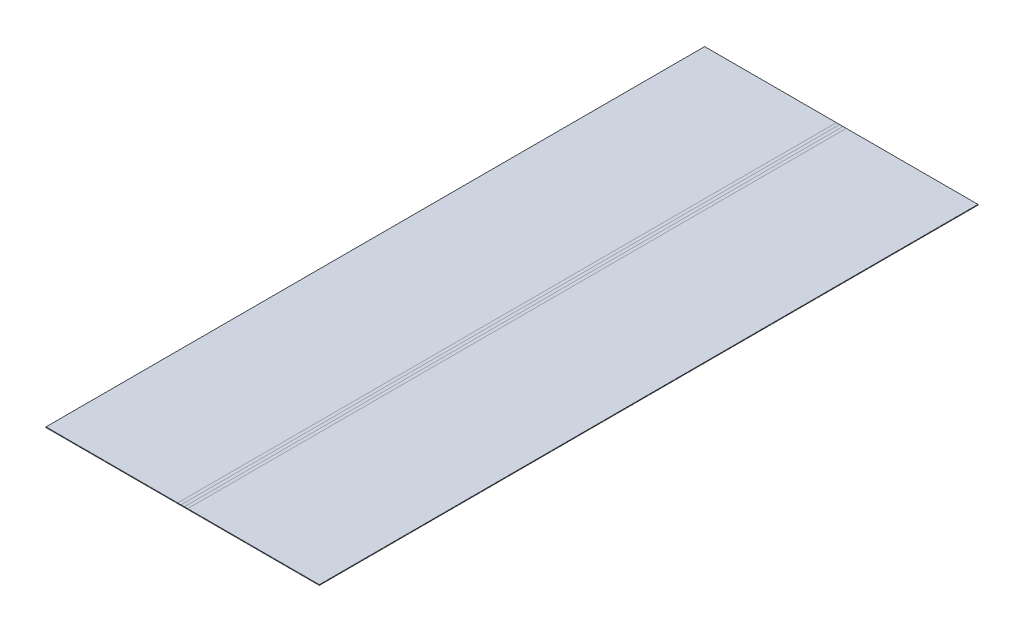
ISO-10303-21;
HEADER;
FILE_DESCRIPTION(('STEP AP214'),'2;1');
FILE_NAME('part.step','',(''),(''),'','','');
FILE_SCHEMA(('AUTOMOTIVE_DESIGN { 1 0 10303 214 1 1 1 1 }'));
ENDSEC;
DATA;
#1=APPLICATION_CONTEXT('core data for automotive mechanical design processes');
#2=APPLICATION_PROTOCOL_DEFINITION('international standard','automotive_design',2000,#1);
#3=PRODUCT_CONTEXT('',#1,'mechanical');
#4=PRODUCT('Part','Part','',(#3));
#5=PRODUCT_RELATED_PRODUCT_CATEGORY('part','',(#4));
#6=PRODUCT_DEFINITION_FORMATION('','',#4);
#7=PRODUCT_DEFINITION_CONTEXT('part definition',#1,'design');
#8=PRODUCT_DEFINITION('design','',#6,#7);
#9=PRODUCT_DEFINITION_SHAPE('','',#8);
#10=(LENGTH_UNIT() NAMED_UNIT(*) SI_UNIT(.MILLI.,.METRE.));
#11=(NAMED_UNIT(*) PLANE_ANGLE_UNIT() SI_UNIT($,.RADIAN.));
#12=(NAMED_UNIT(*) SI_UNIT($,.STERADIAN.) SOLID_ANGLE_UNIT());
#13=UNCERTAINTY_MEASURE_WITH_UNIT(LENGTH_MEASURE(1.E-05),#10,'distance_accuracy_value','');
#14=(GEOMETRIC_REPRESENTATION_CONTEXT(3) GLOBAL_UNCERTAINTY_ASSIGNED_CONTEXT((#13)) GLOBAL_UNIT_ASSIGNED_CONTEXT((#10,
#11,#12)) REPRESENTATION_CONTEXT('',''));
#15=CARTESIAN_POINT('',(0.,0.,0.));
#16=DIRECTION('',(0.,0.,1.));
#17=DIRECTION('',(1.,0.,0.));
#18=AXIS2_PLACEMENT_3D('',#15,#16,#17);
#19=CARTESIAN_POINT('',(2075.,10.,-1.84297022087776E-13));
#20=DIRECTION('',(1.,0.,0.));
#21=DIRECTION('',(0.,0.,-1.));
#22=AXIS2_PLACEMENT_3D('',#19,#20,#21);
#23=PLANE('',#22);
#24=DIRECTION('',(0.,0.,1.));
#25=VECTOR('',#24,1.);
#26=CARTESIAN_POINT('',(2075.,0.,-1.84297022087776E-13));
#27=LINE('',#26,#25);
#28=CARTESIAN_POINT('',(2075.,0.,-5000.));
#29=VERTEX_POINT('',#28);
#30=CARTESIAN_POINT('',(2075.,0.,5000.));
#31=VERTEX_POINT('',#30);
#32=EDGE_CURVE('E110',#29,#31,#27,.T.);
#33=ORIENTED_EDGE('',*,*,#32,.F.);
#34=DIRECTION('',(0.,-1.,0.));
#35=VECTOR('',#34,1.);
#36=CARTESIAN_POINT('',(2075.,10.,-5000.));
#37=LINE('',#36,#35);
#38=CARTESIAN_POINT('',(2075.,10.,-5000.));
#39=VERTEX_POINT('',#38);
#40=EDGE_CURVE('E12',#39,#29,#37,.T.);
#41=ORIENTED_EDGE('',*,*,#40,.F.);
#42=DIRECTION('',(0.,0.,1.));
#43=VECTOR('',#42,1.);
#44=CARTESIAN_POINT('',(2075.,10.,-1.84297022087776E-13));
#45=LINE('',#44,#43);
#46=CARTESIAN_POINT('',(2075.,10.,5000.));
#47=VERTEX_POINT('',#46);
#48=EDGE_CURVE('E104',#39,#47,#45,.T.);
#49=ORIENTED_EDGE('',*,*,#48,.T.);
#50=DIRECTION('',(0.,-1.,0.));
#51=VECTOR('',#50,1.);
#52=CARTESIAN_POINT('',(2075.,10.,5000.));
#53=LINE('',#52,#51);
#54=EDGE_CURVE('E85',#47,#31,#53,.T.);
#55=ORIENTED_EDGE('',*,*,#54,.T.);
#56=EDGE_LOOP('',(#33,#41,#49,#55));
#57=FACE_BOUND('',#56,.T.);
#58=ADVANCED_FACE('F47',(#57),#23,.T.);
#59=CARTESIAN_POINT('',(6.66133814775094E-12,10.,-5000.));
#60=DIRECTION('',(0.,0.,-1.));
#61=DIRECTION('',(-1.,0.,0.));
#62=AXIS2_PLACEMENT_3D('',#59,#60,#61);
#63=PLANE('',#62);
#64=DIRECTION('',(1.,0.,0.));
#65=VECTOR('',#64,1.);
#66=CARTESIAN_POINT('',(6.66133814775094E-12,0.,-5000.));
#67=LINE('',#66,#65);
#68=CARTESIAN_POINT('',(75.0000000000026,0.,-5000.));
#69=VERTEX_POINT('',#68);
#70=EDGE_CURVE('E98',#69,#29,#67,.T.);
#71=ORIENTED_EDGE('',*,*,#70,.F.);
#72=DIRECTION('',(0.,-1.,0.));
#73=VECTOR('',#72,1.);
#74=CARTESIAN_POINT('',(75.0000000000026,10.,-5000.));
#75=LINE('',#74,#73);
#76=CARTESIAN_POINT('',(75.0000000000026,10.,-5000.));
#77=VERTEX_POINT('',#76);
#78=EDGE_CURVE('E55',#77,#69,#75,.T.);
#79=ORIENTED_EDGE('',*,*,#78,.F.);
#80=DIRECTION('',(1.,0.,0.));
#81=VECTOR('',#80,1.);
#82=CARTESIAN_POINT('',(6.66133814775094E-12,10.,-5000.));
#83=LINE('',#82,#81);
#84=EDGE_CURVE('E96',#77,#39,#83,.T.);
#85=ORIENTED_EDGE('',*,*,#84,.T.);
#86=ORIENTED_EDGE('',*,*,#40,.T.);
#87=EDGE_LOOP('',(#71,#79,#85,#86));
#88=FACE_BOUND('',#87,.T.);
#89=ADVANCED_FACE('F94',(#88),#63,.T.);
#90=CARTESIAN_POINT('',(75.0000000000033,10.,0.));
#91=DIRECTION('',(1.,0.,0.));
#92=DIRECTION('',(0.,0.,-1.));
#93=AXIS2_PLACEMENT_3D('',#90,#91,#92);
#94=PLANE('',#93);
#95=DIRECTION('',(0.,0.,1.));
#96=VECTOR('',#95,1.);
#97=CARTESIAN_POINT('',(75.0000000000033,0.,0.));
#98=LINE('',#97,#96);
#99=CARTESIAN_POINT('',(75.0000000000039,0.,5000.));
#100=VERTEX_POINT('',#99);
#101=EDGE_CURVE('E78',#69,#100,#98,.T.);
#102=ORIENTED_EDGE('',*,*,#101,.T.);
#103=DIRECTION('',(0.,-1.,0.));
#104=VECTOR('',#103,1.);
#105=CARTESIAN_POINT('',(75.0000000000039,10.,5000.));
#106=LINE('',#105,#104);
#107=CARTESIAN_POINT('',(75.0000000000039,10.,5000.));
#108=VERTEX_POINT('',#107);
#109=EDGE_CURVE('E99',#108,#100,#106,.T.);
#110=ORIENTED_EDGE('',*,*,#109,.F.);
#111=DIRECTION('',(0.,0.,1.));
#112=VECTOR('',#111,1.);
#113=CARTESIAN_POINT('',(75.0000000000033,10.,0.));
#114=LINE('',#113,#112);
#115=EDGE_CURVE('E100',#77,#108,#114,.T.);
#116=ORIENTED_EDGE('',*,*,#115,.F.);
#117=ORIENTED_EDGE('',*,*,#78,.T.);
#118=EDGE_LOOP('',(#102,#110,#116,#117));
#119=FACE_BOUND('',#118,.T.);
#120=ADVANCED_FACE('F101',(#119),#94,.F.);
#121=CARTESIAN_POINT('',(-6.66133814775094E-12,10.,5000.));
#122=DIRECTION('',(0.,0.,-1.));
#123=DIRECTION('',(-1.,0.,0.));
#124=AXIS2_PLACEMENT_3D('',#121,#122,#123);
#125=PLANE('',#124);
#126=DIRECTION('',(1.,0.,0.));
#127=VECTOR('',#126,1.);
#128=CARTESIAN_POINT('',(-6.66133814775094E-12,0.,5000.));
#129=LINE('',#128,#127);
#130=EDGE_CURVE('E106',#100,#31,#129,.T.);
#131=ORIENTED_EDGE('',*,*,#130,.T.);
#132=ORIENTED_EDGE('',*,*,#54,.F.);
#133=DIRECTION('',(1.,0.,0.));
#134=VECTOR('',#133,1.);
#135=CARTESIAN_POINT('',(-6.66133814775094E-12,10.,5000.));
#136=LINE('',#135,#134);
#137=EDGE_CURVE('E63',#108,#47,#136,.T.);
#138=ORIENTED_EDGE('',*,*,#137,.F.);
#139=ORIENTED_EDGE('',*,*,#109,.T.);
#140=EDGE_LOOP('',(#131,#132,#138,#139));
#141=FACE_BOUND('',#140,.T.);
#142=ADVANCED_FACE('F119',(#141),#125,.F.);
#143=CARTESIAN_POINT('',(0.,10.,0.));
#144=DIRECTION('',(0.,1.,0.));
#145=DIRECTION('',(0.,0.,1.));
#146=AXIS2_PLACEMENT_3D('',#143,#144,#145);
#147=PLANE('',#146);
#148=ORIENTED_EDGE('',*,*,#48,.F.);
#149=ORIENTED_EDGE('',*,*,#84,.F.);
#150=ORIENTED_EDGE('',*,*,#115,.T.);
#151=ORIENTED_EDGE('',*,*,#137,.T.);
#152=EDGE_LOOP('',(#148,#149,#150,#151));
#153=FACE_BOUND('',#152,.T.);
#154=ADVANCED_FACE('F103',(#153),#147,.T.);
#155=CARTESIAN_POINT('',(0.,0.,0.));
#156=DIRECTION('',(0.,1.,0.));
#157=DIRECTION('',(0.,0.,1.));
#158=AXIS2_PLACEMENT_3D('',#155,#156,#157);
#159=PLANE('',#158);
#160=ORIENTED_EDGE('',*,*,#32,.T.);
#161=ORIENTED_EDGE('',*,*,#130,.F.);
#162=ORIENTED_EDGE('',*,*,#101,.F.);
#163=ORIENTED_EDGE('',*,*,#70,.T.);
#164=EDGE_LOOP('',(#160,#161,#162,#163));
#165=FACE_BOUND('',#164,.T.);
#166=ADVANCED_FACE('F121',(#165),#159,.F.);
#167=CLOSED_SHELL('',(#58,#89,#120,#142,#154,#166));
#168=MANIFOLD_SOLID_BREP('B2',#167);
#169=CARTESIAN_POINT('',(-75.0000000000033,10.,0.));
#170=DIRECTION('',(1.,0.,0.));
#171=DIRECTION('',(0.,0.,-1.));
#172=AXIS2_PLACEMENT_3D('',#169,#170,#171);
#173=PLANE('',#172);
#174=DIRECTION('',(0.,0.,1.));
#175=VECTOR('',#174,1.);
#176=CARTESIAN_POINT('',(-75.0000000000033,0.,0.));
#177=LINE('',#176,#175);
#178=CARTESIAN_POINT('',(-75.0000000000026,0.,-5000.));
#179=VERTEX_POINT('',#178);
#180=CARTESIAN_POINT('',(-75.0000000000039,0.,5000.));
#181=VERTEX_POINT('',#180);
#182=EDGE_CURVE('E248',#179,#181,#177,.T.);
#183=ORIENTED_EDGE('',*,*,#182,.F.);
#184=DIRECTION('',(0.,-1.,0.));
#185=VECTOR('',#184,1.);
#186=CARTESIAN_POINT('',(-75.0000000000026,10.,-5000.));
#187=LINE('',#186,#185);
#188=CARTESIAN_POINT('',(-75.0000000000026,10.,-5000.));
#189=VERTEX_POINT('',#188);
#190=EDGE_CURVE('E45',#189,#179,#187,.T.);
#191=ORIENTED_EDGE('',*,*,#190,.F.);
#192=DIRECTION('',(0.,0.,1.));
#193=VECTOR('',#192,1.);
#194=CARTESIAN_POINT('',(-75.0000000000033,10.,0.));
#195=LINE('',#194,#193);
#196=CARTESIAN_POINT('',(-75.0000000000039,10.,5000.));
#197=VERTEX_POINT('',#196);
#198=EDGE_CURVE('E233',#189,#197,#195,.T.);
#199=ORIENTED_EDGE('',*,*,#198,.T.);
#200=DIRECTION('',(0.,-1.,0.));
#201=VECTOR('',#200,1.);
#202=CARTESIAN_POINT('',(-75.0000000000039,10.,5000.));
#203=LINE('',#202,#201);
#204=EDGE_CURVE('E201',#197,#181,#203,.T.);
#205=ORIENTED_EDGE('',*,*,#204,.T.);
#206=EDGE_LOOP('',(#183,#191,#199,#205));
#207=FACE_BOUND('',#206,.T.);
#208=ADVANCED_FACE('F185',(#207),#173,.T.);
#209=CARTESIAN_POINT('',(-6.66133814775094E-12,10.,-5000.));
#210=DIRECTION('',(0.,0.,1.));
#211=DIRECTION('',(1.,0.,0.));
#212=AXIS2_PLACEMENT_3D('',#209,#210,#211);
#213=PLANE('',#212);
#214=DIRECTION('',(-1.,0.,0.));
#215=VECTOR('',#214,1.);
#216=CARTESIAN_POINT('',(-6.66133814775094E-12,0.,-5000.));
#217=LINE('',#216,#215);
#218=CARTESIAN_POINT('',(-2075.,0.,-5000.));
#219=VERTEX_POINT('',#218);
#220=EDGE_CURVE('E239',#179,#219,#217,.T.);
#221=ORIENTED_EDGE('',*,*,#220,.T.);
#222=DIRECTION('',(0.,-1.,0.));
#223=VECTOR('',#222,1.);
#224=CARTESIAN_POINT('',(-2075.,10.,-5000.));
#225=LINE('',#224,#223);
#226=CARTESIAN_POINT('',(-2075.,10.,-5000.));
#227=VERTEX_POINT('',#226);
#228=EDGE_CURVE('E193',#227,#219,#225,.T.);
#229=ORIENTED_EDGE('',*,*,#228,.F.);
#230=DIRECTION('',(-1.,0.,0.));
#231=VECTOR('',#230,1.);
#232=CARTESIAN_POINT('',(-6.66133814775094E-12,10.,-5000.));
#233=LINE('',#232,#231);
#234=EDGE_CURVE('E227',#189,#227,#233,.T.);
#235=ORIENTED_EDGE('',*,*,#234,.F.);
#236=ORIENTED_EDGE('',*,*,#190,.T.);
#237=EDGE_LOOP('',(#221,#229,#235,#236));
#238=FACE_BOUND('',#237,.T.);
#239=ADVANCED_FACE('F237',(#238),#213,.F.);
#240=CARTESIAN_POINT('',(-2075.,10.,-1.84297022087776E-13));
#241=DIRECTION('',(1.,0.,0.));
#242=DIRECTION('',(0.,0.,-1.));
#243=AXIS2_PLACEMENT_3D('',#240,#241,#242);
#244=PLANE('',#243);
#245=DIRECTION('',(0.,0.,1.));
#246=VECTOR('',#245,1.);
#247=CARTESIAN_POINT('',(-2075.,0.,-1.84297022087776E-13));
#248=LINE('',#247,#246);
#249=CARTESIAN_POINT('',(-2075.,0.,5000.));
#250=VERTEX_POINT('',#249);
#251=EDGE_CURVE('E251',#219,#250,#248,.T.);
#252=ORIENTED_EDGE('',*,*,#251,.T.);
#253=DIRECTION('',(0.,-1.,0.));
#254=VECTOR('',#253,1.);
#255=CARTESIAN_POINT('',(-2075.,10.,5000.));
#256=LINE('',#255,#254);
#257=CARTESIAN_POINT('',(-2075.,10.,5000.));
#258=VERTEX_POINT('',#257);
#259=EDGE_CURVE('E215',#258,#250,#256,.T.);
#260=ORIENTED_EDGE('',*,*,#259,.F.);
#261=DIRECTION('',(0.,0.,1.));
#262=VECTOR('',#261,1.);
#263=CARTESIAN_POINT('',(-2075.,10.,-1.84297022087776E-13));
#264=LINE('',#263,#262);
#265=EDGE_CURVE('E232',#227,#258,#264,.T.);
#266=ORIENTED_EDGE('',*,*,#265,.F.);
#267=ORIENTED_EDGE('',*,*,#228,.T.);
#268=EDGE_LOOP('',(#252,#260,#266,#267));
#269=FACE_BOUND('',#268,.T.);
#270=ADVANCED_FACE('F242',(#269),#244,.F.);
#271=CARTESIAN_POINT('',(6.66133814775094E-12,10.,5000.));
#272=DIRECTION('',(0.,0.,1.));
#273=DIRECTION('',(1.,0.,0.));
#274=AXIS2_PLACEMENT_3D('',#271,#272,#273);
#275=PLANE('',#274);
#276=DIRECTION('',(-1.,0.,0.));
#277=VECTOR('',#276,1.);
#278=CARTESIAN_POINT('',(6.66133814775094E-12,0.,5000.));
#279=LINE('',#278,#277);
#280=EDGE_CURVE('E253',#181,#250,#279,.T.);
#281=ORIENTED_EDGE('',*,*,#280,.F.);
#282=ORIENTED_EDGE('',*,*,#204,.F.);
#283=DIRECTION('',(-1.,0.,0.));
#284=VECTOR('',#283,1.);
#285=CARTESIAN_POINT('',(6.66133814775094E-12,10.,5000.));
#286=LINE('',#285,#284);
#287=EDGE_CURVE('E243',#197,#258,#286,.T.);
#288=ORIENTED_EDGE('',*,*,#287,.T.);
#289=ORIENTED_EDGE('',*,*,#259,.T.);
#290=EDGE_LOOP('',(#281,#282,#288,#289));
#291=FACE_BOUND('',#290,.T.);
#292=ADVANCED_FACE('F258',(#291),#275,.T.);
#293=CARTESIAN_POINT('',(0.,10.,0.));
#294=DIRECTION('',(0.,1.,0.));
#295=DIRECTION('',(0.,0.,1.));
#296=AXIS2_PLACEMENT_3D('',#293,#294,#295);
#297=PLANE('',#296);
#298=ORIENTED_EDGE('',*,*,#198,.F.);
#299=ORIENTED_EDGE('',*,*,#234,.T.);
#300=ORIENTED_EDGE('',*,*,#265,.T.);
#301=ORIENTED_EDGE('',*,*,#287,.F.);
#302=EDGE_LOOP('',(#298,#299,#300,#301));
#303=FACE_BOUND('',#302,.T.);
#304=ADVANCED_FACE('F229',(#303),#297,.T.);
#305=CARTESIAN_POINT('',(0.,0.,0.));
#306=DIRECTION('',(0.,1.,0.));
#307=DIRECTION('',(0.,0.,1.));
#308=AXIS2_PLACEMENT_3D('',#305,#306,#307);
#309=PLANE('',#308);
#310=ORIENTED_EDGE('',*,*,#182,.T.);
#311=ORIENTED_EDGE('',*,*,#280,.T.);
#312=ORIENTED_EDGE('',*,*,#251,.F.);
#313=ORIENTED_EDGE('',*,*,#220,.F.);
#314=EDGE_LOOP('',(#310,#311,#312,#313));
#315=FACE_BOUND('',#314,.T.);
#316=ADVANCED_FACE('F265',(#315),#309,.F.);
#317=CLOSED_SHELL('',(#208,#239,#270,#292,#304,#316));
#318=MANIFOLD_SOLID_BREP('B6',#317);
#319=CARTESIAN_POINT('',(75.0000000000033,10.,0.));
#320=DIRECTION('',(1.,0.,0.));
#321=DIRECTION('',(0.,0.,-1.));
#322=AXIS2_PLACEMENT_3D('',#319,#320,#321);
#323=PLANE('',#322);
#324=DIRECTION('',(0.,0.,1.));
#325=VECTOR('',#324,1.);
#326=CARTESIAN_POINT('',(75.0000000000033,0.,0.));
#327=LINE('',#326,#325);
#328=CARTESIAN_POINT('',(75.0000000000026,0.,-5000.));
#329=VERTEX_POINT('',#328);
#330=CARTESIAN_POINT('',(75.0000000000039,0.,5000.));
#331=VERTEX_POINT('',#330);
#332=EDGE_CURVE('E386',#329,#331,#327,.T.);
#333=ORIENTED_EDGE('',*,*,#332,.F.);
#334=DIRECTION('',(0.,-1.,0.));
#335=VECTOR('',#334,1.);
#336=CARTESIAN_POINT('',(75.0000000000026,10.,-5000.));
#337=LINE('',#336,#335);
#338=CARTESIAN_POINT('',(75.0000000000026,10.,-5000.));
#339=VERTEX_POINT('',#338);
#340=EDGE_CURVE('E183',#339,#329,#337,.T.);
#341=ORIENTED_EDGE('',*,*,#340,.F.);
#342=DIRECTION('',(0.,0.,1.));
#343=VECTOR('',#342,1.);
#344=CARTESIAN_POINT('',(75.0000000000033,10.,0.));
#345=LINE('',#344,#343);
#346=CARTESIAN_POINT('',(75.0000000000039,10.,5000.));
#347=VERTEX_POINT('',#346);
#348=EDGE_CURVE('E379',#339,#347,#345,.T.);
#349=ORIENTED_EDGE('',*,*,#348,.T.);
#350=DIRECTION('',(0.,-1.,0.));
#351=VECTOR('',#350,1.);
#352=CARTESIAN_POINT('',(75.0000000000039,10.,5000.));
#353=LINE('',#352,#351);
#354=EDGE_CURVE('E361',#347,#331,#353,.T.);
#355=ORIENTED_EDGE('',*,*,#354,.T.);
#356=EDGE_LOOP('',(#333,#341,#349,#355));
#357=FACE_BOUND('',#356,.T.);
#358=ADVANCED_FACE('F323',(#357),#323,.T.);
#359=CARTESIAN_POINT('',(0.,10.,-5000.));
#360=DIRECTION('',(0.,0.,-1.));
#361=DIRECTION('',(-1.,0.,0.));
#362=AXIS2_PLACEMENT_3D('',#359,#360,#361);
#363=PLANE('',#362);
#364=DIRECTION('',(1.,0.,0.));
#365=VECTOR('',#364,1.);
#366=CARTESIAN_POINT('',(0.,0.,-5000.));
#367=LINE('',#366,#365);
#368=CARTESIAN_POINT('',(25.0000000000027,0.,-5000.));
#369=VERTEX_POINT('',#368);
#370=EDGE_CURVE('E372',#369,#329,#367,.T.);
#371=ORIENTED_EDGE('',*,*,#370,.F.);
#372=DIRECTION('',(0.,-1.,0.));
#373=VECTOR('',#372,1.);
#374=CARTESIAN_POINT('',(25.0000000000027,10.,-5000.));
#375=LINE('',#374,#373);
#376=CARTESIAN_POINT('',(25.0000000000027,10.,-5000.));
#377=VERTEX_POINT('',#376);
#378=EDGE_CURVE('E331',#377,#369,#375,.T.);
#379=ORIENTED_EDGE('',*,*,#378,.F.);
#380=DIRECTION('',(1.,0.,0.));
#381=VECTOR('',#380,1.);
#382=CARTESIAN_POINT('',(0.,10.,-5000.));
#383=LINE('',#382,#381);
#384=EDGE_CURVE('E370',#377,#339,#383,.T.);
#385=ORIENTED_EDGE('',*,*,#384,.T.);
#386=ORIENTED_EDGE('',*,*,#340,.T.);
#387=EDGE_LOOP('',(#371,#379,#385,#386));
#388=FACE_BOUND('',#387,.T.);
#389=ADVANCED_FACE('F369',(#388),#363,.T.);
#390=CARTESIAN_POINT('',(25.0000000000027,10.,0.));
#391=DIRECTION('',(-1.,0.,0.));
#392=DIRECTION('',(0.,0.,1.));
#393=AXIS2_PLACEMENT_3D('',#390,#391,#392);
#394=PLANE('',#393);
#395=DIRECTION('',(0.,0.,-1.));
#396=VECTOR('',#395,1.);
#397=CARTESIAN_POINT('',(25.0000000000027,0.,0.));
#398=LINE('',#397,#396);
#399=CARTESIAN_POINT('',(25.0000000000027,0.,5000.));
#400=VERTEX_POINT('',#399);
#401=EDGE_CURVE('E390',#400,#369,#398,.T.);
#402=ORIENTED_EDGE('',*,*,#401,.F.);
#403=DIRECTION('',(0.,-1.,0.));
#404=VECTOR('',#403,1.);
#405=CARTESIAN_POINT('',(25.0000000000027,10.,5000.));
#406=LINE('',#405,#404);
#407=CARTESIAN_POINT('',(25.0000000000027,10.,5000.));
#408=VERTEX_POINT('',#407);
#409=EDGE_CURVE('E354',#408,#400,#406,.T.);
#410=ORIENTED_EDGE('',*,*,#409,.F.);
#411=DIRECTION('',(0.,0.,-1.));
#412=VECTOR('',#411,1.);
#413=CARTESIAN_POINT('',(25.0000000000027,10.,0.));
#414=LINE('',#413,#412);
#415=EDGE_CURVE('E378',#408,#377,#414,.T.);
#416=ORIENTED_EDGE('',*,*,#415,.T.);
#417=ORIENTED_EDGE('',*,*,#378,.T.);
#418=EDGE_LOOP('',(#402,#410,#416,#417));
#419=FACE_BOUND('',#418,.T.);
#420=ADVANCED_FACE('F381',(#419),#394,.T.);
#421=CARTESIAN_POINT('',(0.,10.,5000.));
#422=DIRECTION('',(0.,0.,-1.));
#423=DIRECTION('',(-1.,0.,0.));
#424=AXIS2_PLACEMENT_3D('',#421,#422,#423);
#425=PLANE('',#424);
#426=DIRECTION('',(1.,0.,0.));
#427=VECTOR('',#426,1.);
#428=CARTESIAN_POINT('',(0.,0.,5000.));
#429=LINE('',#428,#427);
#430=EDGE_CURVE('E392',#400,#331,#429,.T.);
#431=ORIENTED_EDGE('',*,*,#430,.T.);
#432=ORIENTED_EDGE('',*,*,#354,.F.);
#433=DIRECTION('',(1.,0.,0.));
#434=VECTOR('',#433,1.);
#435=CARTESIAN_POINT('',(0.,10.,5000.));
#436=LINE('',#435,#434);
#437=EDGE_CURVE('E339',#408,#347,#436,.T.);
#438=ORIENTED_EDGE('',*,*,#437,.F.);
#439=ORIENTED_EDGE('',*,*,#409,.T.);
#440=EDGE_LOOP('',(#431,#432,#438,#439));
#441=FACE_BOUND('',#440,.T.);
#442=ADVANCED_FACE('F402',(#441),#425,.F.);
#443=CARTESIAN_POINT('',(0.,10.,0.));
#444=DIRECTION('',(0.,1.,0.));
#445=DIRECTION('',(0.,0.,1.));
#446=AXIS2_PLACEMENT_3D('',#443,#444,#445);
#447=PLANE('',#446);
#448=ORIENTED_EDGE('',*,*,#348,.F.);
#449=ORIENTED_EDGE('',*,*,#384,.F.);
#450=ORIENTED_EDGE('',*,*,#415,.F.);
#451=ORIENTED_EDGE('',*,*,#437,.T.);
#452=EDGE_LOOP('',(#448,#449,#450,#451));
#453=FACE_BOUND('',#452,.T.);
#454=ADVANCED_FACE('F377',(#453),#447,.T.);
#455=CARTESIAN_POINT('',(0.,0.,0.));
#456=DIRECTION('',(0.,1.,0.));
#457=DIRECTION('',(0.,0.,1.));
#458=AXIS2_PLACEMENT_3D('',#455,#456,#457);
#459=PLANE('',#458);
#460=ORIENTED_EDGE('',*,*,#332,.T.);
#461=ORIENTED_EDGE('',*,*,#430,.F.);
#462=ORIENTED_EDGE('',*,*,#401,.T.);
#463=ORIENTED_EDGE('',*,*,#370,.T.);
#464=EDGE_LOOP('',(#460,#461,#462,#463));
#465=FACE_BOUND('',#464,.T.);
#466=ADVANCED_FACE('F407',(#465),#459,.F.);
#467=CLOSED_SHELL('',(#358,#389,#420,#442,#454,#466));
#468=MANIFOLD_SOLID_BREP('B39',#467);
#469=CARTESIAN_POINT('',(-25.,10.,0.));
#470=DIRECTION('',(-1.,0.,0.));
#471=DIRECTION('',(0.,0.,1.));
#472=AXIS2_PLACEMENT_3D('',#469,#470,#471);
#473=PLANE('',#472);
#474=DIRECTION('',(0.,0.,-1.));
#475=VECTOR('',#474,1.);
#476=CARTESIAN_POINT('',(-25.,0.,0.));
#477=LINE('',#476,#475);
#478=CARTESIAN_POINT('',(-25.0000000000027,0.,5000.));
#479=VERTEX_POINT('',#478);
#480=CARTESIAN_POINT('',(-24.9999999999974,0.,-5000.));
#481=VERTEX_POINT('',#480);
#482=EDGE_CURVE('E526',#479,#481,#477,.T.);
#483=ORIENTED_EDGE('',*,*,#482,.T.);
#484=DIRECTION('',(0.,-1.,0.));
#485=VECTOR('',#484,1.);
#486=CARTESIAN_POINT('',(-24.9999999999974,10.,-5000.));
#487=LINE('',#486,#485);
#488=CARTESIAN_POINT('',(-24.9999999999974,10.,-5000.));
#489=VERTEX_POINT('',#488);
#490=EDGE_CURVE('E321',#489,#481,#487,.T.);
#491=ORIENTED_EDGE('',*,*,#490,.F.);
#492=DIRECTION('',(0.,0.,-1.));
#493=VECTOR('',#492,1.);
#494=CARTESIAN_POINT('',(-25.,10.,0.));
#495=LINE('',#494,#493);
#496=CARTESIAN_POINT('',(-25.0000000000027,10.,5000.));
#497=VERTEX_POINT('',#496);
#498=EDGE_CURVE('E512',#497,#489,#495,.T.);
#499=ORIENTED_EDGE('',*,*,#498,.F.);
#500=DIRECTION('',(0.,-1.,0.));
#501=VECTOR('',#500,1.);
#502=CARTESIAN_POINT('',(-25.0000000000027,10.,5000.));
#503=LINE('',#502,#501);
#504=EDGE_CURVE('E479',#497,#479,#503,.T.);
#505=ORIENTED_EDGE('',*,*,#504,.T.);
#506=EDGE_LOOP('',(#483,#491,#499,#505));
#507=FACE_BOUND('',#506,.T.);
#508=ADVANCED_FACE('F463',(#507),#473,.F.);
#509=CARTESIAN_POINT('',(0.,10.,-5000.));
#510=DIRECTION('',(0.,0.,1.));
#511=DIRECTION('',(1.,0.,0.));
#512=AXIS2_PLACEMENT_3D('',#509,#510,#511);
#513=PLANE('',#512);
#514=DIRECTION('',(-1.,0.,0.));
#515=VECTOR('',#514,1.);
#516=CARTESIAN_POINT('',(0.,0.,-5000.));
#517=LINE('',#516,#515);
#518=CARTESIAN_POINT('',(-75.0000000000026,0.,-5000.));
#519=VERTEX_POINT('',#518);
#520=EDGE_CURVE('E517',#481,#519,#517,.T.);
#521=ORIENTED_EDGE('',*,*,#520,.T.);
#522=DIRECTION('',(0.,-1.,0.));
#523=VECTOR('',#522,1.);
#524=CARTESIAN_POINT('',(-75.0000000000026,10.,-5000.));
#525=LINE('',#524,#523);
#526=CARTESIAN_POINT('',(-75.0000000000026,10.,-5000.));
#527=VERTEX_POINT('',#526);
#528=EDGE_CURVE('E471',#527,#519,#525,.T.);
#529=ORIENTED_EDGE('',*,*,#528,.F.);
#530=DIRECTION('',(-1.,0.,0.));
#531=VECTOR('',#530,1.);
#532=CARTESIAN_POINT('',(0.,10.,-5000.));
#533=LINE('',#532,#531);
#534=EDGE_CURVE('E505',#489,#527,#533,.T.);
#535=ORIENTED_EDGE('',*,*,#534,.F.);
#536=ORIENTED_EDGE('',*,*,#490,.T.);
#537=EDGE_LOOP('',(#521,#529,#535,#536));
#538=FACE_BOUND('',#537,.T.);
#539=ADVANCED_FACE('F516',(#538),#513,.F.);
#540=CARTESIAN_POINT('',(-75.0000000000033,10.,0.));
#541=DIRECTION('',(1.,0.,0.));
#542=DIRECTION('',(0.,0.,-1.));
#543=AXIS2_PLACEMENT_3D('',#540,#541,#542);
#544=PLANE('',#543);
#545=DIRECTION('',(0.,0.,1.));
#546=VECTOR('',#545,1.);
#547=CARTESIAN_POINT('',(-75.0000000000033,0.,0.));
#548=LINE('',#547,#546);
#549=CARTESIAN_POINT('',(-75.0000000000039,0.,5000.));
#550=VERTEX_POINT('',#549);
#551=EDGE_CURVE('E529',#519,#550,#548,.T.);
#552=ORIENTED_EDGE('',*,*,#551,.T.);
#553=DIRECTION('',(0.,-1.,0.));
#554=VECTOR('',#553,1.);
#555=CARTESIAN_POINT('',(-75.0000000000039,10.,5000.));
#556=LINE('',#555,#554);
#557=CARTESIAN_POINT('',(-75.0000000000039,10.,5000.));
#558=VERTEX_POINT('',#557);
#559=EDGE_CURVE('E494',#558,#550,#556,.T.);
#560=ORIENTED_EDGE('',*,*,#559,.F.);
#561=DIRECTION('',(0.,0.,1.));
#562=VECTOR('',#561,1.);
#563=CARTESIAN_POINT('',(-75.0000000000033,10.,0.));
#564=LINE('',#563,#562);
#565=EDGE_CURVE('E511',#527,#558,#564,.T.);
#566=ORIENTED_EDGE('',*,*,#565,.F.);
#567=ORIENTED_EDGE('',*,*,#528,.T.);
#568=EDGE_LOOP('',(#552,#560,#566,#567));
#569=FACE_BOUND('',#568,.T.);
#570=ADVANCED_FACE('F520',(#569),#544,.F.);
#571=CARTESIAN_POINT('',(0.,10.,5000.));
#572=DIRECTION('',(0.,0.,1.));
#573=DIRECTION('',(1.,0.,0.));
#574=AXIS2_PLACEMENT_3D('',#571,#572,#573);
#575=PLANE('',#574);
#576=DIRECTION('',(-1.,0.,0.));
#577=VECTOR('',#576,1.);
#578=CARTESIAN_POINT('',(0.,0.,5000.));
#579=LINE('',#578,#577);
#580=EDGE_CURVE('E531',#479,#550,#579,.T.);
#581=ORIENTED_EDGE('',*,*,#580,.F.);
#582=ORIENTED_EDGE('',*,*,#504,.F.);
#583=DIRECTION('',(-1.,0.,0.));
#584=VECTOR('',#583,1.);
#585=CARTESIAN_POINT('',(0.,10.,5000.));
#586=LINE('',#585,#584);
#587=EDGE_CURVE('E521',#497,#558,#586,.T.);
#588=ORIENTED_EDGE('',*,*,#587,.T.);
#589=ORIENTED_EDGE('',*,*,#559,.T.);
#590=EDGE_LOOP('',(#581,#582,#588,#589));
#591=FACE_BOUND('',#590,.T.);
#592=ADVANCED_FACE('F537',(#591),#575,.T.);
#593=CARTESIAN_POINT('',(0.,10.,0.));
#594=DIRECTION('',(0.,1.,0.));
#595=DIRECTION('',(0.,0.,1.));
#596=AXIS2_PLACEMENT_3D('',#593,#594,#595);
#597=PLANE('',#596);
#598=ORIENTED_EDGE('',*,*,#498,.T.);
#599=ORIENTED_EDGE('',*,*,#534,.T.);
#600=ORIENTED_EDGE('',*,*,#565,.T.);
#601=ORIENTED_EDGE('',*,*,#587,.F.);
#602=EDGE_LOOP('',(#598,#599,#600,#601));
#603=FACE_BOUND('',#602,.T.);
#604=ADVANCED_FACE('F508',(#603),#597,.T.);
#605=CARTESIAN_POINT('',(0.,0.,0.));
#606=DIRECTION('',(0.,1.,0.));
#607=DIRECTION('',(0.,0.,1.));
#608=AXIS2_PLACEMENT_3D('',#605,#606,#607);
#609=PLANE('',#608);
#610=ORIENTED_EDGE('',*,*,#482,.F.);
#611=ORIENTED_EDGE('',*,*,#580,.T.);
#612=ORIENTED_EDGE('',*,*,#551,.F.);
#613=ORIENTED_EDGE('',*,*,#520,.F.);
#614=EDGE_LOOP('',(#610,#611,#612,#613));
#615=FACE_BOUND('',#614,.T.);
#616=ADVANCED_FACE('F536',(#615),#609,.F.);
#617=CLOSED_SHELL('',(#508,#539,#570,#592,#604,#616));
#618=MANIFOLD_SOLID_BREP('B177',#617);
#619=CARTESIAN_POINT('',(0.,10.,5000.));
#620=DIRECTION('',(0.,0.,-1.));
#621=DIRECTION('',(-1.,0.,0.));
#622=AXIS2_PLACEMENT_3D('',#619,#620,#621);
#623=PLANE('',#622);
#624=DIRECTION('',(1.,0.,0.));
#625=VECTOR('',#624,1.);
#626=CARTESIAN_POINT('',(0.,0.,5000.));
#627=LINE('',#626,#625);
#628=CARTESIAN_POINT('',(-25.0000000000027,0.,5000.));
#629=VERTEX_POINT('',#628);
#630=CARTESIAN_POINT('',(25.0000000000027,0.,5000.));
#631=VERTEX_POINT('',#630);
#632=EDGE_CURVE('E660',#629,#631,#627,.T.);
#633=ORIENTED_EDGE('',*,*,#632,.T.);
#634=DIRECTION('',(0.,-1.,0.));
#635=VECTOR('',#634,1.);
#636=CARTESIAN_POINT('',(25.0000000000027,10.,5000.));
#637=LINE('',#636,#635);
#638=CARTESIAN_POINT('',(25.0000000000027,10.,5000.));
#639=VERTEX_POINT('',#638);
#640=EDGE_CURVE('E461',#639,#631,#637,.T.);
#641=ORIENTED_EDGE('',*,*,#640,.F.);
#642=DIRECTION('',(1.,0.,0.));
#643=VECTOR('',#642,1.);
#644=CARTESIAN_POINT('',(0.,10.,5000.));
#645=LINE('',#644,#643);
#646=CARTESIAN_POINT('',(-25.0000000000027,10.,5000.));
#647=VERTEX_POINT('',#646);
#648=EDGE_CURVE('E646',#647,#639,#645,.T.);
#649=ORIENTED_EDGE('',*,*,#648,.F.);
#650=DIRECTION('',(0.,-1.,0.));
#651=VECTOR('',#650,1.);
#652=CARTESIAN_POINT('',(-25.0000000000027,10.,5000.));
#653=LINE('',#652,#651);
#654=EDGE_CURVE('E613',#647,#629,#653,.T.);
#655=ORIENTED_EDGE('',*,*,#654,.T.);
#656=EDGE_LOOP('',(#633,#641,#649,#655));
#657=FACE_BOUND('',#656,.T.);
#658=ADVANCED_FACE('F597',(#657),#623,.F.);
#659=CARTESIAN_POINT('',(25.0000000000027,10.,0.));
#660=DIRECTION('',(-1.,0.,0.));
#661=DIRECTION('',(0.,0.,1.));
#662=AXIS2_PLACEMENT_3D('',#659,#660,#661);
#663=PLANE('',#662);
#664=DIRECTION('',(0.,0.,-1.));
#665=VECTOR('',#664,1.);
#666=CARTESIAN_POINT('',(25.0000000000027,0.,0.));
#667=LINE('',#666,#665);
#668=CARTESIAN_POINT('',(25.0000000000027,0.,-5000.));
#669=VERTEX_POINT('',#668);
#670=EDGE_CURVE('E651',#631,#669,#667,.T.);
#671=ORIENTED_EDGE('',*,*,#670,.T.);
#672=DIRECTION('',(0.,-1.,0.));
#673=VECTOR('',#672,1.);
#674=CARTESIAN_POINT('',(25.0000000000027,10.,-5000.));
#675=LINE('',#674,#673);
#676=CARTESIAN_POINT('',(25.0000000000027,10.,-5000.));
#677=VERTEX_POINT('',#676);
#678=EDGE_CURVE('E605',#677,#669,#675,.T.);
#679=ORIENTED_EDGE('',*,*,#678,.F.);
#680=DIRECTION('',(0.,0.,-1.));
#681=VECTOR('',#680,1.);
#682=CARTESIAN_POINT('',(25.0000000000027,10.,0.));
#683=LINE('',#682,#681);
#684=EDGE_CURVE('E638',#639,#677,#683,.T.);
#685=ORIENTED_EDGE('',*,*,#684,.F.);
#686=ORIENTED_EDGE('',*,*,#640,.T.);
#687=EDGE_LOOP('',(#671,#679,#685,#686));
#688=FACE_BOUND('',#687,.T.);
#689=ADVANCED_FACE('F650',(#688),#663,.F.);
#690=CARTESIAN_POINT('',(0.,10.,-5000.));
#691=DIRECTION('',(0.,0.,-1.));
#692=DIRECTION('',(-1.,0.,0.));
#693=AXIS2_PLACEMENT_3D('',#690,#691,#692);
#694=PLANE('',#693);
#695=DIRECTION('',(1.,0.,0.));
#696=VECTOR('',#695,1.);
#697=CARTESIAN_POINT('',(0.,0.,-5000.));
#698=LINE('',#697,#696);
#699=CARTESIAN_POINT('',(-24.9999999999974,0.,-5000.));
#700=VERTEX_POINT('',#699);
#701=EDGE_CURVE('E663',#700,#669,#698,.T.);
#702=ORIENTED_EDGE('',*,*,#701,.F.);
#703=DIRECTION('',(0.,-1.,0.));
#704=VECTOR('',#703,1.);
#705=CARTESIAN_POINT('',(-24.9999999999974,10.,-5000.));
#706=LINE('',#705,#704);
#707=CARTESIAN_POINT('',(-24.9999999999974,10.,-5000.));
#708=VERTEX_POINT('',#707);
#709=EDGE_CURVE('E627',#708,#700,#706,.T.);
#710=ORIENTED_EDGE('',*,*,#709,.F.);
#711=DIRECTION('',(1.,0.,0.));
#712=VECTOR('',#711,1.);
#713=CARTESIAN_POINT('',(0.,10.,-5000.));
#714=LINE('',#713,#712);
#715=EDGE_CURVE('E645',#708,#677,#714,.T.);
#716=ORIENTED_EDGE('',*,*,#715,.T.);
#717=ORIENTED_EDGE('',*,*,#678,.T.);
#718=EDGE_LOOP('',(#702,#710,#716,#717));
#719=FACE_BOUND('',#718,.T.);
#720=ADVANCED_FACE('F654',(#719),#694,.T.);
#721=CARTESIAN_POINT('',(-25.,10.,0.));
#722=DIRECTION('',(-1.,0.,0.));
#723=DIRECTION('',(0.,0.,1.));
#724=AXIS2_PLACEMENT_3D('',#721,#722,#723);
#725=PLANE('',#724);
#726=DIRECTION('',(0.,0.,-1.));
#727=VECTOR('',#726,1.);
#728=CARTESIAN_POINT('',(-25.,0.,0.));
#729=LINE('',#728,#727);
#730=EDGE_CURVE('E665',#629,#700,#729,.T.);
#731=ORIENTED_EDGE('',*,*,#730,.F.);
#732=ORIENTED_EDGE('',*,*,#654,.F.);
#733=DIRECTION('',(0.,0.,-1.));
#734=VECTOR('',#733,1.);
#735=CARTESIAN_POINT('',(-25.,10.,0.));
#736=LINE('',#735,#734);
#737=EDGE_CURVE('E655',#647,#708,#736,.T.);
#738=ORIENTED_EDGE('',*,*,#737,.T.);
#739=ORIENTED_EDGE('',*,*,#709,.T.);
#740=EDGE_LOOP('',(#731,#732,#738,#739));
#741=FACE_BOUND('',#740,.T.);
#742=ADVANCED_FACE('F671',(#741),#725,.T.);
#743=CARTESIAN_POINT('',(0.,10.,0.));
#744=DIRECTION('',(0.,1.,0.));
#745=DIRECTION('',(0.,0.,1.));
#746=AXIS2_PLACEMENT_3D('',#743,#744,#745);
#747=PLANE('',#746);
#748=ORIENTED_EDGE('',*,*,#648,.T.);
#749=ORIENTED_EDGE('',*,*,#684,.T.);
#750=ORIENTED_EDGE('',*,*,#715,.F.);
#751=ORIENTED_EDGE('',*,*,#737,.F.);
#752=EDGE_LOOP('',(#748,#749,#750,#751));
#753=FACE_BOUND('',#752,.T.);
#754=ADVANCED_FACE('F642',(#753),#747,.T.);
#755=CARTESIAN_POINT('',(0.,0.,0.));
#756=DIRECTION('',(0.,1.,0.));
#757=DIRECTION('',(0.,0.,1.));
#758=AXIS2_PLACEMENT_3D('',#755,#756,#757);
#759=PLANE('',#758);
#760=ORIENTED_EDGE('',*,*,#632,.F.);
#761=ORIENTED_EDGE('',*,*,#730,.T.);
#762=ORIENTED_EDGE('',*,*,#701,.T.);
#763=ORIENTED_EDGE('',*,*,#670,.F.);
#764=EDGE_LOOP('',(#760,#761,#762,#763));
#765=FACE_BOUND('',#764,.T.);
#766=ADVANCED_FACE('F670',(#765),#759,.F.);
#767=CLOSED_SHELL('',(#658,#689,#720,#742,#754,#766));
#768=MANIFOLD_SOLID_BREP('B315',#767);
#769=ADVANCED_BREP_SHAPE_REPRESENTATION('',(#18,#168,#318,#468,#618,#768),#14);
#770=SHAPE_DEFINITION_REPRESENTATION(#9,#769);
ENDSEC;
END-ISO-10303-21;
